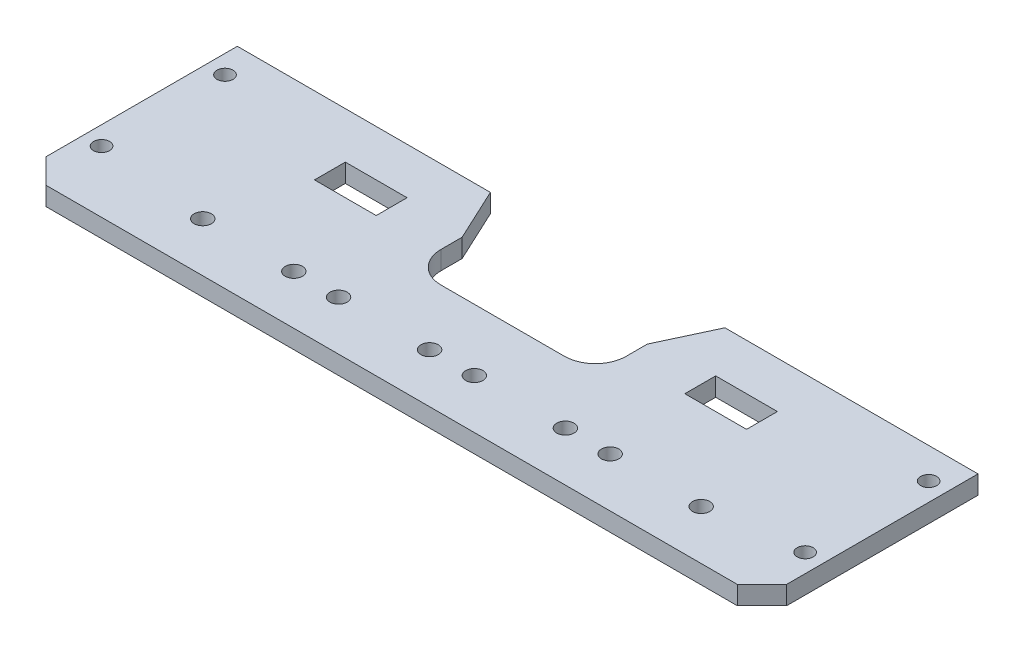
ISO-10303-21;
HEADER;
FILE_DESCRIPTION(('STEP AP214'),'2;1');
FILE_NAME('part.step','',(''),(''),'','','');
FILE_SCHEMA(('AUTOMOTIVE_DESIGN { 1 0 10303 214 1 1 1 1 }'));
ENDSEC;
DATA;
#1=APPLICATION_CONTEXT('core data for automotive mechanical design processes');
#2=APPLICATION_PROTOCOL_DEFINITION('international standard','automotive_design',2000,#1);
#3=PRODUCT_CONTEXT('',#1,'mechanical');
#4=PRODUCT('Part','Part','',(#3));
#5=PRODUCT_RELATED_PRODUCT_CATEGORY('part','',(#4));
#6=PRODUCT_DEFINITION_FORMATION('','',#4);
#7=PRODUCT_DEFINITION_CONTEXT('part definition',#1,'design');
#8=PRODUCT_DEFINITION('design','',#6,#7);
#9=PRODUCT_DEFINITION_SHAPE('','',#8);
#10=(LENGTH_UNIT() NAMED_UNIT(*) SI_UNIT(.MILLI.,.METRE.));
#11=(NAMED_UNIT(*) PLANE_ANGLE_UNIT() SI_UNIT($,.RADIAN.));
#12=(NAMED_UNIT(*) SI_UNIT($,.STERADIAN.) SOLID_ANGLE_UNIT());
#13=UNCERTAINTY_MEASURE_WITH_UNIT(LENGTH_MEASURE(1.E-05),#10,'distance_accuracy_value','');
#14=(GEOMETRIC_REPRESENTATION_CONTEXT(3) GLOBAL_UNCERTAINTY_ASSIGNED_CONTEXT((#13)) GLOBAL_UNIT_ASSIGNED_CONTEXT((#10,
#11,#12)) REPRESENTATION_CONTEXT('',''));
#15=CARTESIAN_POINT('',(0.,0.,0.));
#16=DIRECTION('',(0.,0.,1.));
#17=DIRECTION('',(1.,0.,0.));
#18=AXIS2_PLACEMENT_3D('',#15,#16,#17);
#19=CARTESIAN_POINT('',(-60.,3.,-17.5));
#20=DIRECTION('',(0.,0.,1.));
#21=DIRECTION('',(1.,0.,0.));
#22=AXIS2_PLACEMENT_3D('',#19,#20,#21);
#23=PLANE('',#22);
#24=DIRECTION('',(-1.,0.,0.));
#25=VECTOR('',#24,1.);
#26=CARTESIAN_POINT('',(-60.,3.,-17.5));
#27=LINE('',#26,#25);
#28=CARTESIAN_POINT('',(-19.,3.,-17.5));
#29=VERTEX_POINT('',#28);
#30=CARTESIAN_POINT('',(-60.,3.,-17.5));
#31=VERTEX_POINT('',#30);
#32=EDGE_CURVE('E352',#29,#31,#27,.T.);
#33=ORIENTED_EDGE('',*,*,#32,.F.);
#34=DIRECTION('',(0.,-1.,0.));
#35=VECTOR('',#34,1.);
#36=CARTESIAN_POINT('',(-19.,3.,-17.5));
#37=LINE('',#36,#35);
#38=CARTESIAN_POINT('',(-19.,0.,-17.5));
#39=VERTEX_POINT('',#38);
#40=EDGE_CURVE('E380',#29,#39,#37,.T.);
#41=ORIENTED_EDGE('',*,*,#40,.T.);
#42=DIRECTION('',(-1.,0.,0.));
#43=VECTOR('',#42,1.);
#44=CARTESIAN_POINT('',(-60.,0.,-17.5));
#45=LINE('',#44,#43);
#46=CARTESIAN_POINT('',(-60.,0.,-17.5));
#47=VERTEX_POINT('',#46);
#48=EDGE_CURVE('E363',#39,#47,#45,.T.);
#49=ORIENTED_EDGE('',*,*,#48,.T.);
#50=DIRECTION('',(0.,-1.,0.));
#51=VECTOR('',#50,1.);
#52=CARTESIAN_POINT('',(-60.,3.,-17.5));
#53=LINE('',#52,#51);
#54=EDGE_CURVE('E361',#31,#47,#53,.T.);
#55=ORIENTED_EDGE('',*,*,#54,.F.);
#56=EDGE_LOOP('',(#33,#41,#49,#55));
#57=FACE_BOUND('',#56,.T.);
#58=ADVANCED_FACE('F35',(#57),#23,.F.);
#59=CARTESIAN_POINT('',(60.,3.,-17.5));
#60=DIRECTION('',(-1.,0.,0.));
#61=DIRECTION('',(0.,0.,1.));
#62=AXIS2_PLACEMENT_3D('',#59,#60,#61);
#63=PLANE('',#62);
#64=DIRECTION('',(0.,0.,-1.));
#65=VECTOR('',#64,1.);
#66=CARTESIAN_POINT('',(60.,3.,-17.5));
#67=LINE('',#66,#65);
#68=CARTESIAN_POINT('',(60.,3.,13.5));
#69=VERTEX_POINT('',#68);
#70=CARTESIAN_POINT('',(60.,3.,-17.5));
#71=VERTEX_POINT('',#70);
#72=EDGE_CURVE('E350',#69,#71,#67,.T.);
#73=ORIENTED_EDGE('',*,*,#72,.F.);
#74=DIRECTION('',(0.,-1.,0.));
#75=VECTOR('',#74,1.);
#76=CARTESIAN_POINT('',(60.,3.,13.5));
#77=LINE('',#76,#75);
#78=CARTESIAN_POINT('',(60.,0.,13.5));
#79=VERTEX_POINT('',#78);
#80=EDGE_CURVE('E413',#69,#79,#77,.T.);
#81=ORIENTED_EDGE('',*,*,#80,.T.);
#82=DIRECTION('',(0.,0.,-1.));
#83=VECTOR('',#82,1.);
#84=CARTESIAN_POINT('',(60.,0.,-17.5));
#85=LINE('',#84,#83);
#86=CARTESIAN_POINT('',(60.,0.,-17.5));
#87=VERTEX_POINT('',#86);
#88=EDGE_CURVE('E343',#79,#87,#85,.T.);
#89=ORIENTED_EDGE('',*,*,#88,.T.);
#90=DIRECTION('',(0.,-1.,0.));
#91=VECTOR('',#90,1.);
#92=CARTESIAN_POINT('',(60.,3.,-17.5));
#93=LINE('',#92,#91);
#94=EDGE_CURVE('E372',#71,#87,#93,.T.);
#95=ORIENTED_EDGE('',*,*,#94,.F.);
#96=EDGE_LOOP('',(#73,#81,#89,#95));
#97=FACE_BOUND('',#96,.T.);
#98=ADVANCED_FACE('F434',(#97),#63,.F.);
#99=CARTESIAN_POINT('',(19.,0.,-17.5));
#100=VERTEX_POINT('',#99);
#101=EDGE_CURVE('E364',#87,#100,#45,.T.);
#102=ORIENTED_EDGE('',*,*,#101,.T.);
#103=DIRECTION('',(0.,1.,0.));
#104=VECTOR('',#103,1.);
#105=CARTESIAN_POINT('',(19.,3.,-17.5));
#106=LINE('',#105,#104);
#107=CARTESIAN_POINT('',(19.,3.,-17.5));
#108=VERTEX_POINT('',#107);
#109=EDGE_CURVE('E384',#100,#108,#106,.T.);
#110=ORIENTED_EDGE('',*,*,#109,.T.);
#111=EDGE_CURVE('E354',#71,#108,#27,.T.);
#112=ORIENTED_EDGE('',*,*,#111,.F.);
#113=ORIENTED_EDGE('',*,*,#94,.T.);
#114=EDGE_LOOP('',(#102,#110,#112,#113));
#115=FACE_BOUND('',#114,.T.);
#116=ADVANCED_FACE('F483',(#115),#23,.F.);
#117=CARTESIAN_POINT('',(-60.,3.,-17.5));
#118=DIRECTION('',(1.,0.,0.));
#119=DIRECTION('',(0.,0.,-1.));
#120=AXIS2_PLACEMENT_3D('',#117,#118,#119);
#121=PLANE('',#120);
#122=DIRECTION('',(0.,0.,1.));
#123=VECTOR('',#122,1.);
#124=CARTESIAN_POINT('',(-60.,0.,-17.5));
#125=LINE('',#124,#123);
#126=CARTESIAN_POINT('',(-60.,0.,13.5));
#127=VERTEX_POINT('',#126);
#128=EDGE_CURVE('E367',#47,#127,#125,.T.);
#129=ORIENTED_EDGE('',*,*,#128,.T.);
#130=DIRECTION('',(0.,1.,0.));
#131=VECTOR('',#130,1.);
#132=CARTESIAN_POINT('',(-60.,3.,13.5));
#133=LINE('',#132,#131);
#134=CARTESIAN_POINT('',(-60.,3.,13.5));
#135=VERTEX_POINT('',#134);
#136=EDGE_CURVE('E11',#127,#135,#133,.T.);
#137=ORIENTED_EDGE('',*,*,#136,.T.);
#138=DIRECTION('',(0.,0.,1.));
#139=VECTOR('',#138,1.);
#140=CARTESIAN_POINT('',(-60.,3.,-17.5));
#141=LINE('',#140,#139);
#142=EDGE_CURVE('E357',#31,#135,#141,.T.);
#143=ORIENTED_EDGE('',*,*,#142,.F.);
#144=ORIENTED_EDGE('',*,*,#54,.T.);
#145=EDGE_LOOP('',(#129,#137,#143,#144));
#146=FACE_BOUND('',#145,.T.);
#147=ADVANCED_FACE('F446',(#146),#121,.F.);
#148=CARTESIAN_POINT('',(-60.,3.,17.5));
#149=DIRECTION('',(0.,0.,-1.));
#150=DIRECTION('',(-1.,0.,0.));
#151=AXIS2_PLACEMENT_3D('',#148,#149,#150);
#152=PLANE('',#151);
#153=DIRECTION('',(1.,0.,0.));
#154=VECTOR('',#153,1.);
#155=CARTESIAN_POINT('',(-60.,0.,17.5));
#156=LINE('',#155,#154);
#157=CARTESIAN_POINT('',(-56.,0.,17.5));
#158=VERTEX_POINT('',#157);
#159=CARTESIAN_POINT('',(56.,0.,17.5));
#160=VERTEX_POINT('',#159);
#161=EDGE_CURVE('E353',#158,#160,#156,.T.);
#162=ORIENTED_EDGE('',*,*,#161,.T.);
#163=DIRECTION('',(0.,1.,0.));
#164=VECTOR('',#163,1.);
#165=CARTESIAN_POINT('',(56.,3.,17.5));
#166=LINE('',#165,#164);
#167=CARTESIAN_POINT('',(56.,3.,17.5));
#168=VERTEX_POINT('',#167);
#169=EDGE_CURVE('E56',#160,#168,#166,.T.);
#170=ORIENTED_EDGE('',*,*,#169,.T.);
#171=DIRECTION('',(1.,0.,0.));
#172=VECTOR('',#171,1.);
#173=CARTESIAN_POINT('',(-60.,3.,17.5));
#174=LINE('',#173,#172);
#175=CARTESIAN_POINT('',(-56.,3.,17.5));
#176=VERTEX_POINT('',#175);
#177=EDGE_CURVE('E359',#176,#168,#174,.T.);
#178=ORIENTED_EDGE('',*,*,#177,.F.);
#179=DIRECTION('',(0.,-1.,0.));
#180=VECTOR('',#179,1.);
#181=CARTESIAN_POINT('',(-56.,3.,17.5));
#182=LINE('',#181,#180);
#183=EDGE_CURVE('E420',#176,#158,#182,.T.);
#184=ORIENTED_EDGE('',*,*,#183,.T.);
#185=EDGE_LOOP('',(#162,#170,#178,#184));
#186=FACE_BOUND('',#185,.T.);
#187=ADVANCED_FACE('F440',(#186),#152,.F.);
#188=CARTESIAN_POINT('',(0.,3.,0.));
#189=DIRECTION('',(0.,1.,0.));
#190=DIRECTION('',(0.,0.,1.));
#191=AXIS2_PLACEMENT_3D('',#188,#189,#190);
#192=PLANE('',#191);
#193=DIRECTION('',(-1.,0.,0.));
#194=VECTOR('',#193,1.);
#195=CARTESIAN_POINT('',(35.,3.,-10.));
#196=LINE('',#195,#194);
#197=CARTESIAN_POINT('',(35.,3.,-10.));
#198=VERTEX_POINT('',#197);
#199=CARTESIAN_POINT('',(25.,3.,-10.));
#200=VERTEX_POINT('',#199);
#201=EDGE_CURVE('E193',#198,#200,#196,.T.);
#202=ORIENTED_EDGE('',*,*,#201,.F.);
#203=DIRECTION('',(0.,0.,-1.));
#204=VECTOR('',#203,1.);
#205=CARTESIAN_POINT('',(35.,3.,-10.));
#206=LINE('',#205,#204);
#207=CARTESIAN_POINT('',(35.,3.,-5.00000000000001));
#208=VERTEX_POINT('',#207);
#209=EDGE_CURVE('E211',#208,#198,#206,.T.);
#210=ORIENTED_EDGE('',*,*,#209,.F.);
#211=DIRECTION('',(1.,0.,0.));
#212=VECTOR('',#211,1.);
#213=CARTESIAN_POINT('',(35.,3.,-5.00000000000001));
#214=LINE('',#213,#212);
#215=CARTESIAN_POINT('',(25.,3.,-5.00000000000001));
#216=VERTEX_POINT('',#215);
#217=EDGE_CURVE('E214',#216,#208,#214,.T.);
#218=ORIENTED_EDGE('',*,*,#217,.F.);
#219=DIRECTION('',(0.,0.,1.));
#220=VECTOR('',#219,1.);
#221=CARTESIAN_POINT('',(25.,3.,-10.));
#222=LINE('',#221,#220);
#223=EDGE_CURVE('E220',#200,#216,#222,.T.);
#224=ORIENTED_EDGE('',*,*,#223,.F.);
#225=EDGE_LOOP('',(#202,#210,#218,#224));
#226=FACE_BOUND('',#225,.T.);
#227=DIRECTION('',(0.,0.,-1.));
#228=VECTOR('',#227,1.);
#229=CARTESIAN_POINT('',(-25.,3.,-10.));
#230=LINE('',#229,#228);
#231=CARTESIAN_POINT('',(-25.,3.,-5.));
#232=VERTEX_POINT('',#231);
#233=CARTESIAN_POINT('',(-25.,3.,-10.));
#234=VERTEX_POINT('',#233);
#235=EDGE_CURVE('E226',#232,#234,#230,.T.);
#236=ORIENTED_EDGE('',*,*,#235,.F.);
#237=DIRECTION('',(1.,0.,0.));
#238=VECTOR('',#237,1.);
#239=CARTESIAN_POINT('',(-35.,3.,-5.));
#240=LINE('',#239,#238);
#241=CARTESIAN_POINT('',(-35.,3.,-5.));
#242=VERTEX_POINT('',#241);
#243=EDGE_CURVE('E234',#242,#232,#240,.T.);
#244=ORIENTED_EDGE('',*,*,#243,.F.);
#245=DIRECTION('',(0.,0.,1.));
#246=VECTOR('',#245,1.);
#247=CARTESIAN_POINT('',(-35.,3.,-10.));
#248=LINE('',#247,#246);
#249=CARTESIAN_POINT('',(-35.,3.,-10.));
#250=VERTEX_POINT('',#249);
#251=EDGE_CURVE('E248',#250,#242,#248,.T.);
#252=ORIENTED_EDGE('',*,*,#251,.F.);
#253=DIRECTION('',(-1.,0.,0.));
#254=VECTOR('',#253,1.);
#255=CARTESIAN_POINT('',(-35.,3.,-10.));
#256=LINE('',#255,#254);
#257=EDGE_CURVE('E245',#234,#250,#256,.T.);
#258=ORIENTED_EDGE('',*,*,#257,.F.);
#259=EDGE_LOOP('',(#236,#244,#252,#258));
#260=FACE_BOUND('',#259,.T.);
#261=CARTESIAN_POINT('',(20.15,3.,9.5));
#262=DIRECTION('',(0.,1.,0.));
#263=DIRECTION('',(0.,0.,1.));
#264=AXIS2_PLACEMENT_3D('',#261,#262,#263);
#265=CIRCLE('',#264,1.4);
#266=CARTESIAN_POINT('',(20.15,3.,10.9));
#267=VERTEX_POINT('',#266);
#268=EDGE_CURVE('E266',#267,#267,#265,.T.);
#269=ORIENTED_EDGE('',*,*,#268,.F.);
#270=EDGE_LOOP('',(#269));
#271=FACE_BOUND('',#270,.T.);
#272=CARTESIAN_POINT('',(27.4,3.,9.50000000000001));
#273=DIRECTION('',(0.,1.,0.));
#274=DIRECTION('',(0.,0.,1.));
#275=AXIS2_PLACEMENT_3D('',#272,#273,#274);
#276=CIRCLE('',#275,1.4);
#277=CARTESIAN_POINT('',(27.4,3.,10.9));
#278=VERTEX_POINT('',#277);
#279=EDGE_CURVE('E272',#278,#278,#276,.T.);
#280=ORIENTED_EDGE('',*,*,#279,.F.);
#281=EDGE_LOOP('',(#280));
#282=FACE_BOUND('',#281,.T.);
#283=CARTESIAN_POINT('',(42.15,3.,9.50000000000001));
#284=DIRECTION('',(0.,1.,0.));
#285=DIRECTION('',(0.,0.,1.));
#286=AXIS2_PLACEMENT_3D('',#283,#284,#285);
#287=CIRCLE('',#286,1.4);
#288=CARTESIAN_POINT('',(42.15,3.,10.9));
#289=VERTEX_POINT('',#288);
#290=EDGE_CURVE('E278',#289,#289,#287,.T.);
#291=ORIENTED_EDGE('',*,*,#290,.F.);
#292=EDGE_LOOP('',(#291));
#293=FACE_BOUND('',#292,.T.);
#294=CARTESIAN_POINT('',(-1.85,3.,9.5));
#295=DIRECTION('',(0.,1.,0.));
#296=DIRECTION('',(0.,0.,1.));
#297=AXIS2_PLACEMENT_3D('',#294,#295,#296);
#298=CIRCLE('',#297,1.4);
#299=CARTESIAN_POINT('',(-1.85,3.,10.9));
#300=VERTEX_POINT('',#299);
#301=EDGE_CURVE('E284',#300,#300,#298,.T.);
#302=ORIENTED_EDGE('',*,*,#301,.F.);
#303=EDGE_LOOP('',(#302));
#304=FACE_BOUND('',#303,.T.);
#305=CARTESIAN_POINT('',(-16.6,3.,9.50000000000001));
#306=DIRECTION('',(0.,1.,0.));
#307=DIRECTION('',(0.,0.,1.));
#308=AXIS2_PLACEMENT_3D('',#305,#306,#307);
#309=CIRCLE('',#308,1.4);
#310=CARTESIAN_POINT('',(-16.6,3.,10.9));
#311=VERTEX_POINT('',#310);
#312=EDGE_CURVE('E290',#311,#311,#309,.T.);
#313=ORIENTED_EDGE('',*,*,#312,.F.);
#314=EDGE_LOOP('',(#313));
#315=FACE_BOUND('',#314,.T.);
#316=CARTESIAN_POINT('',(-23.85,3.,9.50000000000001));
#317=DIRECTION('',(0.,1.,0.));
#318=DIRECTION('',(0.,0.,1.));
#319=AXIS2_PLACEMENT_3D('',#316,#317,#318);
#320=CIRCLE('',#319,1.4);
#321=CARTESIAN_POINT('',(-23.85,3.,10.9));
#322=VERTEX_POINT('',#321);
#323=EDGE_CURVE('E296',#322,#322,#320,.T.);
#324=ORIENTED_EDGE('',*,*,#323,.F.);
#325=EDGE_LOOP('',(#324));
#326=FACE_BOUND('',#325,.T.);
#327=CARTESIAN_POINT('',(-38.6,3.,9.5));
#328=DIRECTION('',(0.,1.,0.));
#329=DIRECTION('',(0.,0.,1.));
#330=AXIS2_PLACEMENT_3D('',#327,#328,#329);
#331=CIRCLE('',#330,1.4);
#332=CARTESIAN_POINT('',(-38.6,3.,10.9));
#333=VERTEX_POINT('',#332);
#334=EDGE_CURVE('E255',#333,#333,#331,.T.);
#335=ORIENTED_EDGE('',*,*,#334,.F.);
#336=EDGE_LOOP('',(#335));
#337=FACE_BOUND('',#336,.T.);
#338=CARTESIAN_POINT('',(5.4,3.,9.50000000000001));
#339=DIRECTION('',(0.,1.,0.));
#340=DIRECTION('',(0.,0.,1.));
#341=AXIS2_PLACEMENT_3D('',#338,#339,#340);
#342=CIRCLE('',#341,1.4);
#343=CARTESIAN_POINT('',(5.4,3.,10.9));
#344=VERTEX_POINT('',#343);
#345=EDGE_CURVE('E265',#344,#344,#342,.T.);
#346=ORIENTED_EDGE('',*,*,#345,.F.);
#347=EDGE_LOOP('',(#346));
#348=FACE_BOUND('',#347,.T.);
#349=CARTESIAN_POINT('',(-57.,3.,7.50000000000001));
#350=DIRECTION('',(0.,1.,0.));
#351=DIRECTION('',(0.,0.,1.));
#352=AXIS2_PLACEMENT_3D('',#349,#350,#351);
#353=CIRCLE('',#352,1.3);
#354=CARTESIAN_POINT('',(-57.,3.,8.80000000000001));
#355=VERTEX_POINT('',#354);
#356=EDGE_CURVE('E314',#355,#355,#353,.T.);
#357=ORIENTED_EDGE('',*,*,#356,.F.);
#358=EDGE_LOOP('',(#357));
#359=FACE_BOUND('',#358,.T.);
#360=CARTESIAN_POINT('',(57.,3.,7.50000000000001));
#361=DIRECTION('',(0.,1.,0.));
#362=DIRECTION('',(0.,0.,-1.));
#363=AXIS2_PLACEMENT_3D('',#360,#361,#362);
#364=CIRCLE('',#363,1.3);
#365=CARTESIAN_POINT('',(57.,3.,6.2));
#366=VERTEX_POINT('',#365);
#367=EDGE_CURVE('E320',#366,#366,#364,.T.);
#368=ORIENTED_EDGE('',*,*,#367,.F.);
#369=EDGE_LOOP('',(#368));
#370=FACE_BOUND('',#369,.T.);
#371=CARTESIAN_POINT('',(57.,3.,-12.5));
#372=DIRECTION('',(0.,1.,0.));
#373=DIRECTION('',(0.,0.,-1.));
#374=AXIS2_PLACEMENT_3D('',#371,#372,#373);
#375=CIRCLE('',#374,1.3);
#376=CARTESIAN_POINT('',(57.,3.,-13.8));
#377=VERTEX_POINT('',#376);
#378=EDGE_CURVE('E307',#377,#377,#375,.T.);
#379=ORIENTED_EDGE('',*,*,#378,.F.);
#380=EDGE_LOOP('',(#379));
#381=FACE_BOUND('',#380,.T.);
#382=CARTESIAN_POINT('',(-57.,3.,-12.5));
#383=DIRECTION('',(0.,1.,0.));
#384=DIRECTION('',(0.,0.,1.));
#385=AXIS2_PLACEMENT_3D('',#382,#383,#384);
#386=CIRCLE('',#385,1.3);
#387=CARTESIAN_POINT('',(-57.,3.,-11.2));
#388=VERTEX_POINT('',#387);
#389=EDGE_CURVE('E313',#388,#388,#386,.T.);
#390=ORIENTED_EDGE('',*,*,#389,.F.);
#391=EDGE_LOOP('',(#390));
#392=FACE_BOUND('',#391,.T.);
#393=ORIENTED_EDGE('',*,*,#177,.T.);
#394=DIRECTION('',(-0.707106781186549,0.,0.707106781186546));
#395=VECTOR('',#394,1.);
#396=CARTESIAN_POINT('',(36.7499999999999,3.,36.75));
#397=LINE('',#396,#395);
#398=EDGE_CURVE('E43',#168,#69,#397,.F.);
#399=ORIENTED_EDGE('',*,*,#398,.T.);
#400=ORIENTED_EDGE('',*,*,#72,.T.);
#401=ORIENTED_EDGE('',*,*,#111,.T.);
#402=DIRECTION('',(0.4226182617407,0.,-0.90630778703665));
#403=VECTOR('',#402,1.);
#404=CARTESIAN_POINT('',(8.90359341473108,3.,4.15181379438752));
#405=LINE('',#404,#403);
#406=CARTESIAN_POINT('',(15.,3.,-8.92197231796174));
#407=VERTEX_POINT('',#406);
#408=EDGE_CURVE('E387',#108,#407,#405,.F.);
#409=ORIENTED_EDGE('',*,*,#408,.T.);
#410=DIRECTION('',(0.,0.,-1.));
#411=VECTOR('',#410,1.);
#412=CARTESIAN_POINT('',(15.,3.,-17.5));
#413=LINE('',#412,#411);
#414=CARTESIAN_POINT('',(15.,3.,-5.5));
#415=VERTEX_POINT('',#414);
#416=EDGE_CURVE('E338',#415,#407,#413,.T.);
#417=ORIENTED_EDGE('',*,*,#416,.F.);
#418=CARTESIAN_POINT('',(10.,3.,-5.5));
#419=DIRECTION('',(0.,1.,0.));
#420=DIRECTION('',(0.,0.,1.));
#421=AXIS2_PLACEMENT_3D('',#418,#419,#420);
#422=CIRCLE('',#421,5.);
#423=CARTESIAN_POINT('',(10.,3.,-0.499999999999996));
#424=VERTEX_POINT('',#423);
#425=EDGE_CURVE('E405',#415,#424,#422,.F.);
#426=ORIENTED_EDGE('',*,*,#425,.T.);
#427=DIRECTION('',(1.,0.,0.));
#428=VECTOR('',#427,1.);
#429=CARTESIAN_POINT('',(-15.,3.,-0.499999999999993));
#430=LINE('',#429,#428);
#431=CARTESIAN_POINT('',(-10.,3.,-0.499999999999994));
#432=VERTEX_POINT('',#431);
#433=EDGE_CURVE('E346',#432,#424,#430,.T.);
#434=ORIENTED_EDGE('',*,*,#433,.F.);
#435=CARTESIAN_POINT('',(-10.,3.,-5.49999999999999));
#436=DIRECTION('',(0.,1.,0.));
#437=DIRECTION('',(0.,0.,1.));
#438=AXIS2_PLACEMENT_3D('',#435,#436,#437);
#439=CIRCLE('',#438,5.);
#440=CARTESIAN_POINT('',(-15.,3.,-5.49999999999999));
#441=VERTEX_POINT('',#440);
#442=EDGE_CURVE('E409',#432,#441,#439,.F.);
#443=ORIENTED_EDGE('',*,*,#442,.T.);
#444=DIRECTION('',(0.,0.,1.));
#445=VECTOR('',#444,1.);
#446=CARTESIAN_POINT('',(-15.,3.,-17.5));
#447=LINE('',#446,#445);
#448=CARTESIAN_POINT('',(-15.,3.,-8.92197231796174));
#449=VERTEX_POINT('',#448);
#450=EDGE_CURVE('E331',#449,#441,#447,.T.);
#451=ORIENTED_EDGE('',*,*,#450,.F.);
#452=DIRECTION('',(0.4226182617407,0.,0.90630778703665));
#453=VECTOR('',#452,1.);
#454=CARTESIAN_POINT('',(-8.90359341473106,3.,4.15181379438752));
#455=LINE('',#454,#453);
#456=EDGE_CURVE('E378',#449,#29,#455,.F.);
#457=ORIENTED_EDGE('',*,*,#456,.T.);
#458=ORIENTED_EDGE('',*,*,#32,.T.);
#459=ORIENTED_EDGE('',*,*,#142,.T.);
#460=DIRECTION('',(-0.707106781186546,0.,-0.707106781186549));
#461=VECTOR('',#460,1.);
#462=CARTESIAN_POINT('',(-36.7500000000001,3.,36.75));
#463=LINE('',#462,#461);
#464=EDGE_CURVE('E424',#135,#176,#463,.F.);
#465=ORIENTED_EDGE('',*,*,#464,.T.);
#466=EDGE_LOOP('',(#393,#399,#400,#401,#409,#417,#426,#434,#443,#451,#457,#458,#459,#465));
#467=FACE_BOUND('',#466,.T.);
#468=ADVANCED_FACE('F428',(#226,#260,#271,#282,#293,#304,#315,#326,#337,#348,#359,#370,#381,
#392,#467),#192,.T.);
#469=CARTESIAN_POINT('',(0.,0.,0.));
#470=DIRECTION('',(0.,1.,0.));
#471=DIRECTION('',(0.,0.,1.));
#472=AXIS2_PLACEMENT_3D('',#469,#470,#471);
#473=PLANE('',#472);
#474=DIRECTION('',(0.,0.,-1.));
#475=VECTOR('',#474,1.);
#476=CARTESIAN_POINT('',(35.,0.,-10.));
#477=LINE('',#476,#475);
#478=CARTESIAN_POINT('',(35.,0.,-5.00000000000001));
#479=VERTEX_POINT('',#478);
#480=CARTESIAN_POINT('',(35.,0.,-10.));
#481=VERTEX_POINT('',#480);
#482=EDGE_CURVE('E198',#479,#481,#477,.T.);
#483=ORIENTED_EDGE('',*,*,#482,.T.);
#484=DIRECTION('',(-1.,0.,0.));
#485=VECTOR('',#484,1.);
#486=CARTESIAN_POINT('',(35.,0.,-10.));
#487=LINE('',#486,#485);
#488=CARTESIAN_POINT('',(25.,0.,-10.));
#489=VERTEX_POINT('',#488);
#490=EDGE_CURVE('E190',#481,#489,#487,.T.);
#491=ORIENTED_EDGE('',*,*,#490,.T.);
#492=DIRECTION('',(0.,0.,1.));
#493=VECTOR('',#492,1.);
#494=CARTESIAN_POINT('',(25.,0.,-10.));
#495=LINE('',#494,#493);
#496=CARTESIAN_POINT('',(25.,0.,-5.00000000000001));
#497=VERTEX_POINT('',#496);
#498=EDGE_CURVE('E202',#489,#497,#495,.T.);
#499=ORIENTED_EDGE('',*,*,#498,.T.);
#500=DIRECTION('',(1.,0.,0.));
#501=VECTOR('',#500,1.);
#502=CARTESIAN_POINT('',(35.,0.,-5.00000000000001));
#503=LINE('',#502,#501);
#504=EDGE_CURVE('E206',#497,#479,#503,.T.);
#505=ORIENTED_EDGE('',*,*,#504,.T.);
#506=EDGE_LOOP('',(#483,#491,#499,#505));
#507=FACE_BOUND('',#506,.T.);
#508=DIRECTION('',(1.,0.,0.));
#509=VECTOR('',#508,1.);
#510=CARTESIAN_POINT('',(-35.,0.,-5.));
#511=LINE('',#510,#509);
#512=CARTESIAN_POINT('',(-35.,0.,-5.));
#513=VERTEX_POINT('',#512);
#514=CARTESIAN_POINT('',(-25.,0.,-5.));
#515=VERTEX_POINT('',#514);
#516=EDGE_CURVE('E240',#513,#515,#511,.T.);
#517=ORIENTED_EDGE('',*,*,#516,.T.);
#518=DIRECTION('',(0.,0.,-1.));
#519=VECTOR('',#518,1.);
#520=CARTESIAN_POINT('',(-25.,0.,-10.));
#521=LINE('',#520,#519);
#522=CARTESIAN_POINT('',(-25.,0.,-10.));
#523=VERTEX_POINT('',#522);
#524=EDGE_CURVE('E230',#515,#523,#521,.T.);
#525=ORIENTED_EDGE('',*,*,#524,.T.);
#526=DIRECTION('',(-1.,0.,0.));
#527=VECTOR('',#526,1.);
#528=CARTESIAN_POINT('',(-35.,0.,-10.));
#529=LINE('',#528,#527);
#530=CARTESIAN_POINT('',(-35.,0.,-10.));
#531=VERTEX_POINT('',#530);
#532=EDGE_CURVE('E233',#523,#531,#529,.T.);
#533=ORIENTED_EDGE('',*,*,#532,.T.);
#534=DIRECTION('',(0.,0.,1.));
#535=VECTOR('',#534,1.);
#536=CARTESIAN_POINT('',(-35.,0.,-10.));
#537=LINE('',#536,#535);
#538=EDGE_CURVE('E237',#531,#513,#537,.T.);
#539=ORIENTED_EDGE('',*,*,#538,.T.);
#540=EDGE_LOOP('',(#517,#525,#533,#539));
#541=FACE_BOUND('',#540,.T.);
#542=CARTESIAN_POINT('',(20.15,0.,9.5));
#543=DIRECTION('',(0.,1.,0.));
#544=DIRECTION('',(0.,0.,1.));
#545=AXIS2_PLACEMENT_3D('',#542,#543,#544);
#546=CIRCLE('',#545,1.4);
#547=CARTESIAN_POINT('',(20.15,0.,10.9));
#548=VERTEX_POINT('',#547);
#549=EDGE_CURVE('E262',#548,#548,#546,.T.);
#550=ORIENTED_EDGE('',*,*,#549,.T.);
#551=EDGE_LOOP('',(#550));
#552=FACE_BOUND('',#551,.T.);
#553=CARTESIAN_POINT('',(27.4,0.,9.50000000000001));
#554=DIRECTION('',(0.,1.,0.));
#555=DIRECTION('',(0.,0.,1.));
#556=AXIS2_PLACEMENT_3D('',#553,#554,#555);
#557=CIRCLE('',#556,1.4);
#558=CARTESIAN_POINT('',(27.4,0.,10.9));
#559=VERTEX_POINT('',#558);
#560=EDGE_CURVE('E269',#559,#559,#557,.T.);
#561=ORIENTED_EDGE('',*,*,#560,.T.);
#562=EDGE_LOOP('',(#561));
#563=FACE_BOUND('',#562,.T.);
#564=CARTESIAN_POINT('',(42.15,0.,9.50000000000001));
#565=DIRECTION('',(0.,1.,0.));
#566=DIRECTION('',(0.,0.,1.));
#567=AXIS2_PLACEMENT_3D('',#564,#565,#566);
#568=CIRCLE('',#567,1.4);
#569=CARTESIAN_POINT('',(42.15,0.,10.9));
#570=VERTEX_POINT('',#569);
#571=EDGE_CURVE('E275',#570,#570,#568,.T.);
#572=ORIENTED_EDGE('',*,*,#571,.T.);
#573=EDGE_LOOP('',(#572));
#574=FACE_BOUND('',#573,.T.);
#575=CARTESIAN_POINT('',(-1.85,0.,9.5));
#576=DIRECTION('',(0.,1.,0.));
#577=DIRECTION('',(0.,0.,1.));
#578=AXIS2_PLACEMENT_3D('',#575,#576,#577);
#579=CIRCLE('',#578,1.4);
#580=CARTESIAN_POINT('',(-1.85,0.,10.9));
#581=VERTEX_POINT('',#580);
#582=EDGE_CURVE('E281',#581,#581,#579,.T.);
#583=ORIENTED_EDGE('',*,*,#582,.T.);
#584=EDGE_LOOP('',(#583));
#585=FACE_BOUND('',#584,.T.);
#586=CARTESIAN_POINT('',(-16.6,0.,9.50000000000001));
#587=DIRECTION('',(0.,1.,0.));
#588=DIRECTION('',(0.,0.,1.));
#589=AXIS2_PLACEMENT_3D('',#586,#587,#588);
#590=CIRCLE('',#589,1.4);
#591=CARTESIAN_POINT('',(-16.6,0.,10.9));
#592=VERTEX_POINT('',#591);
#593=EDGE_CURVE('E287',#592,#592,#590,.T.);
#594=ORIENTED_EDGE('',*,*,#593,.T.);
#595=EDGE_LOOP('',(#594));
#596=FACE_BOUND('',#595,.T.);
#597=CARTESIAN_POINT('',(-23.85,0.,9.50000000000001));
#598=DIRECTION('',(0.,1.,0.));
#599=DIRECTION('',(0.,0.,1.));
#600=AXIS2_PLACEMENT_3D('',#597,#598,#599);
#601=CIRCLE('',#600,1.4);
#602=CARTESIAN_POINT('',(-23.85,0.,10.9));
#603=VERTEX_POINT('',#602);
#604=EDGE_CURVE('E293',#603,#603,#601,.T.);
#605=ORIENTED_EDGE('',*,*,#604,.T.);
#606=EDGE_LOOP('',(#605));
#607=FACE_BOUND('',#606,.T.);
#608=CARTESIAN_POINT('',(-38.6,0.,9.5));
#609=DIRECTION('',(0.,1.,0.));
#610=DIRECTION('',(0.,0.,1.));
#611=AXIS2_PLACEMENT_3D('',#608,#609,#610);
#612=CIRCLE('',#611,1.4);
#613=CARTESIAN_POINT('',(-38.6,0.,10.9));
#614=VERTEX_POINT('',#613);
#615=EDGE_CURVE('E299',#614,#614,#612,.T.);
#616=ORIENTED_EDGE('',*,*,#615,.T.);
#617=EDGE_LOOP('',(#616));
#618=FACE_BOUND('',#617,.T.);
#619=CARTESIAN_POINT('',(5.4,0.,9.50000000000001));
#620=DIRECTION('',(0.,1.,0.));
#621=DIRECTION('',(0.,0.,1.));
#622=AXIS2_PLACEMENT_3D('',#619,#620,#621);
#623=CIRCLE('',#622,1.4);
#624=CARTESIAN_POINT('',(5.4,0.,10.9));
#625=VERTEX_POINT('',#624);
#626=EDGE_CURVE('E304',#625,#625,#623,.T.);
#627=ORIENTED_EDGE('',*,*,#626,.T.);
#628=EDGE_LOOP('',(#627));
#629=FACE_BOUND('',#628,.T.);
#630=CARTESIAN_POINT('',(-57.,0.,7.50000000000001));
#631=DIRECTION('',(0.,1.,0.));
#632=DIRECTION('',(0.,0.,1.));
#633=AXIS2_PLACEMENT_3D('',#630,#631,#632);
#634=CIRCLE('',#633,1.3);
#635=CARTESIAN_POINT('',(-57.,0.,8.80000000000001));
#636=VERTEX_POINT('',#635);
#637=EDGE_CURVE('E310',#636,#636,#634,.T.);
#638=ORIENTED_EDGE('',*,*,#637,.T.);
#639=EDGE_LOOP('',(#638));
#640=FACE_BOUND('',#639,.T.);
#641=CARTESIAN_POINT('',(57.,0.,7.50000000000001));
#642=DIRECTION('',(0.,1.,0.));
#643=DIRECTION('',(0.,0.,-1.));
#644=AXIS2_PLACEMENT_3D('',#641,#642,#643);
#645=CIRCLE('',#644,1.3);
#646=CARTESIAN_POINT('',(57.,0.,6.2));
#647=VERTEX_POINT('',#646);
#648=EDGE_CURVE('E317',#647,#647,#645,.T.);
#649=ORIENTED_EDGE('',*,*,#648,.T.);
#650=EDGE_LOOP('',(#649));
#651=FACE_BOUND('',#650,.T.);
#652=CARTESIAN_POINT('',(57.,0.,-12.5));
#653=DIRECTION('',(0.,1.,0.));
#654=DIRECTION('',(0.,0.,-1.));
#655=AXIS2_PLACEMENT_3D('',#652,#653,#654);
#656=CIRCLE('',#655,1.3);
#657=CARTESIAN_POINT('',(57.,0.,-13.8));
#658=VERTEX_POINT('',#657);
#659=EDGE_CURVE('E323',#658,#658,#656,.T.);
#660=ORIENTED_EDGE('',*,*,#659,.T.);
#661=EDGE_LOOP('',(#660));
#662=FACE_BOUND('',#661,.T.);
#663=CARTESIAN_POINT('',(-57.,0.,-12.5));
#664=DIRECTION('',(0.,1.,0.));
#665=DIRECTION('',(0.,0.,1.));
#666=AXIS2_PLACEMENT_3D('',#663,#664,#665);
#667=CIRCLE('',#666,1.3);
#668=CARTESIAN_POINT('',(-57.,0.,-11.2));
#669=VERTEX_POINT('',#668);
#670=EDGE_CURVE('E328',#669,#669,#667,.T.);
#671=ORIENTED_EDGE('',*,*,#670,.T.);
#672=EDGE_LOOP('',(#671));
#673=FACE_BOUND('',#672,.T.);
#674=ORIENTED_EDGE('',*,*,#88,.F.);
#675=DIRECTION('',(0.707106781186549,0.,-0.707106781186546));
#676=VECTOR('',#675,1.);
#677=CARTESIAN_POINT('',(60.,0.,13.5));
#678=LINE('',#677,#676);
#679=EDGE_CURVE('E418',#79,#160,#678,.F.);
#680=ORIENTED_EDGE('',*,*,#679,.T.);
#681=ORIENTED_EDGE('',*,*,#161,.F.);
#682=DIRECTION('',(0.707106781186546,0.,0.707106781186549));
#683=VECTOR('',#682,1.);
#684=CARTESIAN_POINT('',(-56.,0.,17.5));
#685=LINE('',#684,#683);
#686=EDGE_CURVE('E416',#158,#127,#685,.F.);
#687=ORIENTED_EDGE('',*,*,#686,.T.);
#688=ORIENTED_EDGE('',*,*,#128,.F.);
#689=ORIENTED_EDGE('',*,*,#48,.F.);
#690=DIRECTION('',(-0.4226182617407,0.,-0.90630778703665));
#691=VECTOR('',#690,1.);
#692=CARTESIAN_POINT('',(-15.,0.,-8.92197231796174));
#693=LINE('',#692,#691);
#694=CARTESIAN_POINT('',(-15.,0.,-8.92197231796174));
#695=VERTEX_POINT('',#694);
#696=EDGE_CURVE('E382',#39,#695,#693,.F.);
#697=ORIENTED_EDGE('',*,*,#696,.T.);
#698=DIRECTION('',(0.,0.,1.));
#699=VECTOR('',#698,1.);
#700=CARTESIAN_POINT('',(-15.,0.,-17.5));
#701=LINE('',#700,#699);
#702=CARTESIAN_POINT('',(-15.,0.,-5.49999999999999));
#703=VERTEX_POINT('',#702);
#704=EDGE_CURVE('E334',#695,#703,#701,.T.);
#705=ORIENTED_EDGE('',*,*,#704,.T.);
#706=CARTESIAN_POINT('',(-10.,0.,-5.49999999999999));
#707=DIRECTION('',(0.,1.,0.));
#708=DIRECTION('',(0.,0.,1.));
#709=AXIS2_PLACEMENT_3D('',#706,#707,#708);
#710=CIRCLE('',#709,5.);
#711=CARTESIAN_POINT('',(-10.,0.,-0.499999999999994));
#712=VERTEX_POINT('',#711);
#713=EDGE_CURVE('E411',#703,#712,#710,.T.);
#714=ORIENTED_EDGE('',*,*,#713,.T.);
#715=DIRECTION('',(1.,0.,0.));
#716=VECTOR('',#715,1.);
#717=CARTESIAN_POINT('',(-15.,0.,-0.499999999999993));
#718=LINE('',#717,#716);
#719=CARTESIAN_POINT('',(10.,0.,-0.499999999999996));
#720=VERTEX_POINT('',#719);
#721=EDGE_CURVE('E337',#712,#720,#718,.T.);
#722=ORIENTED_EDGE('',*,*,#721,.T.);
#723=CARTESIAN_POINT('',(10.,0.,-5.5));
#724=DIRECTION('',(0.,1.,0.));
#725=DIRECTION('',(0.,0.,1.));
#726=AXIS2_PLACEMENT_3D('',#723,#724,#725);
#727=CIRCLE('',#726,5.);
#728=CARTESIAN_POINT('',(15.,0.,-5.5));
#729=VERTEX_POINT('',#728);
#730=EDGE_CURVE('E407',#720,#729,#727,.T.);
#731=ORIENTED_EDGE('',*,*,#730,.T.);
#732=DIRECTION('',(0.,0.,-1.));
#733=VECTOR('',#732,1.);
#734=CARTESIAN_POINT('',(15.,0.,-17.5));
#735=LINE('',#734,#733);
#736=CARTESIAN_POINT('',(15.,0.,-8.92197231796174));
#737=VERTEX_POINT('',#736);
#738=EDGE_CURVE('E341',#729,#737,#735,.T.);
#739=ORIENTED_EDGE('',*,*,#738,.T.);
#740=DIRECTION('',(-0.4226182617407,0.,0.90630778703665));
#741=VECTOR('',#740,1.);
#742=CARTESIAN_POINT('',(19.,0.,-17.5));
#743=LINE('',#742,#741);
#744=EDGE_CURVE('E393',#737,#100,#743,.F.);
#745=ORIENTED_EDGE('',*,*,#744,.T.);
#746=ORIENTED_EDGE('',*,*,#101,.F.);
#747=EDGE_LOOP('',(#674,#680,#681,#687,#688,#689,#697,#705,#714,#722,#731,#739,#745,#746));
#748=FACE_BOUND('',#747,.T.);
#749=ADVANCED_FACE('F208',(#507,#541,#552,#563,#574,#585,#596,#607,#618,#629,#640,#651,#662,
#673,#748),#473,.F.);
#750=CARTESIAN_POINT('',(-15.,0.,-17.5));
#751=DIRECTION('',(-1.,0.,0.));
#752=DIRECTION('',(0.,0.,1.));
#753=AXIS2_PLACEMENT_3D('',#750,#751,#752);
#754=PLANE('',#753);
#755=ORIENTED_EDGE('',*,*,#450,.T.);
#756=DIRECTION('',(0.,1.,0.));
#757=VECTOR('',#756,1.);
#758=CARTESIAN_POINT('',(-15.,0.,-5.49999999999999));
#759=LINE('',#758,#757);
#760=EDGE_CURVE('E403',#441,#703,#759,.F.);
#761=ORIENTED_EDGE('',*,*,#760,.T.);
#762=ORIENTED_EDGE('',*,*,#704,.F.);
#763=DIRECTION('',(0.,1.,0.));
#764=VECTOR('',#763,1.);
#765=CARTESIAN_POINT('',(-15.,0.,-8.92197231796174));
#766=LINE('',#765,#764);
#767=EDGE_CURVE('E375',#695,#449,#766,.T.);
#768=ORIENTED_EDGE('',*,*,#767,.T.);
#769=EDGE_LOOP('',(#755,#761,#762,#768));
#770=FACE_BOUND('',#769,.T.);
#771=ADVANCED_FACE('F458',(#770),#754,.F.);
#772=CARTESIAN_POINT('',(15.,0.,-17.5));
#773=DIRECTION('',(1.,0.,0.));
#774=DIRECTION('',(0.,0.,-1.));
#775=AXIS2_PLACEMENT_3D('',#772,#773,#774);
#776=PLANE('',#775);
#777=ORIENTED_EDGE('',*,*,#738,.F.);
#778=DIRECTION('',(0.,1.,0.));
#779=VECTOR('',#778,1.);
#780=CARTESIAN_POINT('',(15.,3.,-5.5));
#781=LINE('',#780,#779);
#782=EDGE_CURVE('E395',#729,#415,#781,.T.);
#783=ORIENTED_EDGE('',*,*,#782,.T.);
#784=ORIENTED_EDGE('',*,*,#416,.T.);
#785=DIRECTION('',(0.,-1.,0.));
#786=VECTOR('',#785,1.);
#787=CARTESIAN_POINT('',(15.,0.,-8.92197231796174));
#788=LINE('',#787,#786);
#789=EDGE_CURVE('E390',#407,#737,#788,.T.);
#790=ORIENTED_EDGE('',*,*,#789,.T.);
#791=EDGE_LOOP('',(#777,#783,#784,#790));
#792=FACE_BOUND('',#791,.T.);
#793=ADVANCED_FACE('F476',(#792),#776,.F.);
#794=CARTESIAN_POINT('',(-15.,0.,-0.499999999999993));
#795=DIRECTION('',(0.,0.,1.));
#796=DIRECTION('',(1.,0.,0.));
#797=AXIS2_PLACEMENT_3D('',#794,#795,#796);
#798=PLANE('',#797);
#799=ORIENTED_EDGE('',*,*,#433,.T.);
#800=DIRECTION('',(0.,1.,0.));
#801=VECTOR('',#800,1.);
#802=CARTESIAN_POINT('',(10.,0.,-0.499999999999996));
#803=LINE('',#802,#801);
#804=EDGE_CURVE('E401',#424,#720,#803,.F.);
#805=ORIENTED_EDGE('',*,*,#804,.T.);
#806=ORIENTED_EDGE('',*,*,#721,.F.);
#807=DIRECTION('',(0.,1.,0.));
#808=VECTOR('',#807,1.);
#809=CARTESIAN_POINT('',(-10.,3.,-0.499999999999994));
#810=LINE('',#809,#808);
#811=EDGE_CURVE('E398',#712,#432,#810,.T.);
#812=ORIENTED_EDGE('',*,*,#811,.T.);
#813=EDGE_LOOP('',(#799,#805,#806,#812));
#814=FACE_BOUND('',#813,.T.);
#815=ADVANCED_FACE('F467',(#814),#798,.F.);
#816=CARTESIAN_POINT('',(-57.,0.,-12.5));
#817=DIRECTION('',(0.,1.,0.));
#818=DIRECTION('',(0.,0.,1.));
#819=AXIS2_PLACEMENT_3D('',#816,#817,#818);
#820=CYLINDRICAL_SURFACE('',#819,1.3);
#821=ORIENTED_EDGE('',*,*,#670,.F.);
#822=EDGE_LOOP('',(#821));
#823=FACE_BOUND('',#822,.T.);
#824=ORIENTED_EDGE('',*,*,#389,.T.);
#825=EDGE_LOOP('',(#824));
#826=FACE_BOUND('',#825,.T.);
#827=ADVANCED_FACE('F721',(#823,#826),#820,.F.);
#828=CARTESIAN_POINT('',(57.,0.,-12.5));
#829=DIRECTION('',(0.,1.,0.));
#830=DIRECTION('',(0.,0.,1.));
#831=AXIS2_PLACEMENT_3D('',#828,#829,#830);
#832=CYLINDRICAL_SURFACE('',#831,1.3);
#833=ORIENTED_EDGE('',*,*,#659,.F.);
#834=EDGE_LOOP('',(#833));
#835=FACE_BOUND('',#834,.T.);
#836=ORIENTED_EDGE('',*,*,#378,.T.);
#837=EDGE_LOOP('',(#836));
#838=FACE_BOUND('',#837,.T.);
#839=ADVANCED_FACE('F713',(#835,#838),#832,.F.);
#840=CARTESIAN_POINT('',(57.,0.,7.50000000000001));
#841=DIRECTION('',(0.,1.,0.));
#842=DIRECTION('',(0.,0.,1.));
#843=AXIS2_PLACEMENT_3D('',#840,#841,#842);
#844=CYLINDRICAL_SURFACE('',#843,1.3);
#845=ORIENTED_EDGE('',*,*,#648,.F.);
#846=EDGE_LOOP('',(#845));
#847=FACE_BOUND('',#846,.T.);
#848=ORIENTED_EDGE('',*,*,#367,.T.);
#849=EDGE_LOOP('',(#848));
#850=FACE_BOUND('',#849,.T.);
#851=ADVANCED_FACE('F705',(#847,#850),#844,.F.);
#852=CARTESIAN_POINT('',(-57.,0.,7.50000000000001));
#853=DIRECTION('',(0.,1.,0.));
#854=DIRECTION('',(0.,0.,1.));
#855=AXIS2_PLACEMENT_3D('',#852,#853,#854);
#856=CYLINDRICAL_SURFACE('',#855,1.3);
#857=ORIENTED_EDGE('',*,*,#637,.F.);
#858=EDGE_LOOP('',(#857));
#859=FACE_BOUND('',#858,.T.);
#860=ORIENTED_EDGE('',*,*,#356,.T.);
#861=EDGE_LOOP('',(#860));
#862=FACE_BOUND('',#861,.T.);
#863=ADVANCED_FACE('F697',(#859,#862),#856,.F.);
#864=CARTESIAN_POINT('',(5.4,0.,9.50000000000001));
#865=DIRECTION('',(0.,1.,0.));
#866=DIRECTION('',(0.,0.,1.));
#867=AXIS2_PLACEMENT_3D('',#864,#865,#866);
#868=CYLINDRICAL_SURFACE('',#867,1.4);
#869=ORIENTED_EDGE('',*,*,#626,.F.);
#870=EDGE_LOOP('',(#869));
#871=FACE_BOUND('',#870,.T.);
#872=ORIENTED_EDGE('',*,*,#345,.T.);
#873=EDGE_LOOP('',(#872));
#874=FACE_BOUND('',#873,.T.);
#875=ADVANCED_FACE('F689',(#871,#874),#868,.F.);
#876=CARTESIAN_POINT('',(-38.6,0.,9.5));
#877=DIRECTION('',(0.,1.,0.));
#878=DIRECTION('',(0.,0.,1.));
#879=AXIS2_PLACEMENT_3D('',#876,#877,#878);
#880=CYLINDRICAL_SURFACE('',#879,1.4);
#881=ORIENTED_EDGE('',*,*,#615,.F.);
#882=EDGE_LOOP('',(#881));
#883=FACE_BOUND('',#882,.T.);
#884=ORIENTED_EDGE('',*,*,#334,.T.);
#885=EDGE_LOOP('',(#884));
#886=FACE_BOUND('',#885,.T.);
#887=ADVANCED_FACE('F681',(#883,#886),#880,.F.);
#888=CARTESIAN_POINT('',(-23.85,0.,9.50000000000001));
#889=DIRECTION('',(0.,1.,0.));
#890=DIRECTION('',(0.,0.,1.));
#891=AXIS2_PLACEMENT_3D('',#888,#889,#890);
#892=CYLINDRICAL_SURFACE('',#891,1.4);
#893=ORIENTED_EDGE('',*,*,#604,.F.);
#894=EDGE_LOOP('',(#893));
#895=FACE_BOUND('',#894,.T.);
#896=ORIENTED_EDGE('',*,*,#323,.T.);
#897=EDGE_LOOP('',(#896));
#898=FACE_BOUND('',#897,.T.);
#899=ADVANCED_FACE('F673',(#895,#898),#892,.F.);
#900=CARTESIAN_POINT('',(-16.6,0.,9.50000000000001));
#901=DIRECTION('',(0.,1.,0.));
#902=DIRECTION('',(0.,0.,1.));
#903=AXIS2_PLACEMENT_3D('',#900,#901,#902);
#904=CYLINDRICAL_SURFACE('',#903,1.4);
#905=ORIENTED_EDGE('',*,*,#593,.F.);
#906=EDGE_LOOP('',(#905));
#907=FACE_BOUND('',#906,.T.);
#908=ORIENTED_EDGE('',*,*,#312,.T.);
#909=EDGE_LOOP('',(#908));
#910=FACE_BOUND('',#909,.T.);
#911=ADVANCED_FACE('F665',(#907,#910),#904,.F.);
#912=CARTESIAN_POINT('',(-1.85,0.,9.5));
#913=DIRECTION('',(0.,1.,0.));
#914=DIRECTION('',(0.,0.,1.));
#915=AXIS2_PLACEMENT_3D('',#912,#913,#914);
#916=CYLINDRICAL_SURFACE('',#915,1.4);
#917=ORIENTED_EDGE('',*,*,#582,.F.);
#918=EDGE_LOOP('',(#917));
#919=FACE_BOUND('',#918,.T.);
#920=ORIENTED_EDGE('',*,*,#301,.T.);
#921=EDGE_LOOP('',(#920));
#922=FACE_BOUND('',#921,.T.);
#923=ADVANCED_FACE('F657',(#919,#922),#916,.F.);
#924=CARTESIAN_POINT('',(42.15,0.,9.50000000000001));
#925=DIRECTION('',(0.,1.,0.));
#926=DIRECTION('',(0.,0.,1.));
#927=AXIS2_PLACEMENT_3D('',#924,#925,#926);
#928=CYLINDRICAL_SURFACE('',#927,1.4);
#929=ORIENTED_EDGE('',*,*,#571,.F.);
#930=EDGE_LOOP('',(#929));
#931=FACE_BOUND('',#930,.T.);
#932=ORIENTED_EDGE('',*,*,#290,.T.);
#933=EDGE_LOOP('',(#932));
#934=FACE_BOUND('',#933,.T.);
#935=ADVANCED_FACE('F649',(#931,#934),#928,.F.);
#936=CARTESIAN_POINT('',(27.4,0.,9.50000000000001));
#937=DIRECTION('',(0.,1.,0.));
#938=DIRECTION('',(0.,0.,1.));
#939=AXIS2_PLACEMENT_3D('',#936,#937,#938);
#940=CYLINDRICAL_SURFACE('',#939,1.4);
#941=ORIENTED_EDGE('',*,*,#560,.F.);
#942=EDGE_LOOP('',(#941));
#943=FACE_BOUND('',#942,.T.);
#944=ORIENTED_EDGE('',*,*,#279,.T.);
#945=EDGE_LOOP('',(#944));
#946=FACE_BOUND('',#945,.T.);
#947=ADVANCED_FACE('F641',(#943,#946),#940,.F.);
#948=CARTESIAN_POINT('',(20.15,0.,9.5));
#949=DIRECTION('',(0.,1.,0.));
#950=DIRECTION('',(0.,0.,1.));
#951=AXIS2_PLACEMENT_3D('',#948,#949,#950);
#952=CYLINDRICAL_SURFACE('',#951,1.4);
#953=ORIENTED_EDGE('',*,*,#549,.F.);
#954=EDGE_LOOP('',(#953));
#955=FACE_BOUND('',#954,.T.);
#956=ORIENTED_EDGE('',*,*,#268,.T.);
#957=EDGE_LOOP('',(#956));
#958=FACE_BOUND('',#957,.T.);
#959=ADVANCED_FACE('F633',(#955,#958),#952,.F.);
#960=CARTESIAN_POINT('',(-25.,0.,-10.));
#961=DIRECTION('',(1.,0.,0.));
#962=DIRECTION('',(0.,0.,-1.));
#963=AXIS2_PLACEMENT_3D('',#960,#961,#962);
#964=PLANE('',#963);
#965=ORIENTED_EDGE('',*,*,#235,.T.);
#966=DIRECTION('',(0.,1.,0.));
#967=VECTOR('',#966,1.);
#968=CARTESIAN_POINT('',(-25.,0.,-10.));
#969=LINE('',#968,#967);
#970=EDGE_CURVE('E243',#523,#234,#969,.T.);
#971=ORIENTED_EDGE('',*,*,#970,.F.);
#972=ORIENTED_EDGE('',*,*,#524,.F.);
#973=DIRECTION('',(0.,1.,0.));
#974=VECTOR('',#973,1.);
#975=CARTESIAN_POINT('',(-25.,0.,-5.));
#976=LINE('',#975,#974);
#977=EDGE_CURVE('E253',#515,#232,#976,.T.);
#978=ORIENTED_EDGE('',*,*,#977,.T.);
#979=EDGE_LOOP('',(#965,#971,#972,#978));
#980=FACE_BOUND('',#979,.T.);
#981=ADVANCED_FACE('F625',(#980),#964,.F.);
#982=CARTESIAN_POINT('',(-35.,0.,-5.));
#983=DIRECTION('',(0.,0.,1.));
#984=DIRECTION('',(1.,0.,0.));
#985=AXIS2_PLACEMENT_3D('',#982,#983,#984);
#986=PLANE('',#985);
#987=ORIENTED_EDGE('',*,*,#243,.T.);
#988=ORIENTED_EDGE('',*,*,#977,.F.);
#989=ORIENTED_EDGE('',*,*,#516,.F.);
#990=DIRECTION('',(0.,1.,0.));
#991=VECTOR('',#990,1.);
#992=CARTESIAN_POINT('',(-35.,0.,-5.));
#993=LINE('',#992,#991);
#994=EDGE_CURVE('E256',#513,#242,#993,.T.);
#995=ORIENTED_EDGE('',*,*,#994,.T.);
#996=EDGE_LOOP('',(#987,#988,#989,#995));
#997=FACE_BOUND('',#996,.T.);
#998=ADVANCED_FACE('F617',(#997),#986,.F.);
#999=CARTESIAN_POINT('',(-35.,0.,-10.));
#1000=DIRECTION('',(-1.,0.,0.));
#1001=DIRECTION('',(0.,0.,1.));
#1002=AXIS2_PLACEMENT_3D('',#999,#1000,#1001);
#1003=PLANE('',#1002);
#1004=ORIENTED_EDGE('',*,*,#251,.T.);
#1005=ORIENTED_EDGE('',*,*,#994,.F.);
#1006=ORIENTED_EDGE('',*,*,#538,.F.);
#1007=DIRECTION('',(0.,1.,0.));
#1008=VECTOR('',#1007,1.);
#1009=CARTESIAN_POINT('',(-35.,0.,-10.));
#1010=LINE('',#1009,#1008);
#1011=EDGE_CURVE('E258',#531,#250,#1010,.T.);
#1012=ORIENTED_EDGE('',*,*,#1011,.T.);
#1013=EDGE_LOOP('',(#1004,#1005,#1006,#1012));
#1014=FACE_BOUND('',#1013,.T.);
#1015=ADVANCED_FACE('F609',(#1014),#1003,.F.);
#1016=CARTESIAN_POINT('',(-35.,0.,-10.));
#1017=DIRECTION('',(0.,0.,-1.));
#1018=DIRECTION('',(-1.,0.,0.));
#1019=AXIS2_PLACEMENT_3D('',#1016,#1017,#1018);
#1020=PLANE('',#1019);
#1021=ORIENTED_EDGE('',*,*,#257,.T.);
#1022=ORIENTED_EDGE('',*,*,#1011,.F.);
#1023=ORIENTED_EDGE('',*,*,#532,.F.);
#1024=ORIENTED_EDGE('',*,*,#970,.T.);
#1025=EDGE_LOOP('',(#1021,#1022,#1023,#1024));
#1026=FACE_BOUND('',#1025,.T.);
#1027=ADVANCED_FACE('F602',(#1026),#1020,.F.);
#1028=CARTESIAN_POINT('',(35.,0.,-10.));
#1029=DIRECTION('',(0.,0.,-1.));
#1030=DIRECTION('',(-1.,0.,0.));
#1031=AXIS2_PLACEMENT_3D('',#1028,#1029,#1030);
#1032=PLANE('',#1031);
#1033=ORIENTED_EDGE('',*,*,#201,.T.);
#1034=DIRECTION('',(0.,1.,0.));
#1035=VECTOR('',#1034,1.);
#1036=CARTESIAN_POINT('',(25.,0.,-10.));
#1037=LINE('',#1036,#1035);
#1038=EDGE_CURVE('E186',#489,#200,#1037,.T.);
#1039=ORIENTED_EDGE('',*,*,#1038,.F.);
#1040=ORIENTED_EDGE('',*,*,#490,.F.);
#1041=DIRECTION('',(0.,1.,0.));
#1042=VECTOR('',#1041,1.);
#1043=CARTESIAN_POINT('',(35.,0.,-10.));
#1044=LINE('',#1043,#1042);
#1045=EDGE_CURVE('E224',#481,#198,#1044,.T.);
#1046=ORIENTED_EDGE('',*,*,#1045,.T.);
#1047=EDGE_LOOP('',(#1033,#1039,#1040,#1046));
#1048=FACE_BOUND('',#1047,.T.);
#1049=ADVANCED_FACE('F188',(#1048),#1032,.F.);
#1050=CARTESIAN_POINT('',(35.,0.,-10.));
#1051=DIRECTION('',(1.,0.,0.));
#1052=DIRECTION('',(0.,0.,-1.));
#1053=AXIS2_PLACEMENT_3D('',#1050,#1051,#1052);
#1054=PLANE('',#1053);
#1055=ORIENTED_EDGE('',*,*,#209,.T.);
#1056=ORIENTED_EDGE('',*,*,#1045,.F.);
#1057=ORIENTED_EDGE('',*,*,#482,.F.);
#1058=DIRECTION('',(0.,1.,0.));
#1059=VECTOR('',#1058,1.);
#1060=CARTESIAN_POINT('',(35.,0.,-5.00000000000001));
#1061=LINE('',#1060,#1059);
#1062=EDGE_CURVE('E227',#479,#208,#1061,.T.);
#1063=ORIENTED_EDGE('',*,*,#1062,.T.);
#1064=EDGE_LOOP('',(#1055,#1056,#1057,#1063));
#1065=FACE_BOUND('',#1064,.T.);
#1066=ADVANCED_FACE('F587',(#1065),#1054,.F.);
#1067=CARTESIAN_POINT('',(35.,0.,-5.00000000000001));
#1068=DIRECTION('',(0.,0.,1.));
#1069=DIRECTION('',(1.,0.,0.));
#1070=AXIS2_PLACEMENT_3D('',#1067,#1068,#1069);
#1071=PLANE('',#1070);
#1072=ORIENTED_EDGE('',*,*,#217,.T.);
#1073=ORIENTED_EDGE('',*,*,#1062,.F.);
#1074=ORIENTED_EDGE('',*,*,#504,.F.);
#1075=DIRECTION('',(0.,1.,0.));
#1076=VECTOR('',#1075,1.);
#1077=CARTESIAN_POINT('',(25.,0.,-5.00000000000001));
#1078=LINE('',#1077,#1076);
#1079=EDGE_CURVE('E197',#497,#216,#1078,.T.);
#1080=ORIENTED_EDGE('',*,*,#1079,.T.);
#1081=EDGE_LOOP('',(#1072,#1073,#1074,#1080));
#1082=FACE_BOUND('',#1081,.T.);
#1083=ADVANCED_FACE('F580',(#1082),#1071,.F.);
#1084=CARTESIAN_POINT('',(25.,0.,-10.));
#1085=DIRECTION('',(-1.,0.,0.));
#1086=DIRECTION('',(0.,0.,1.));
#1087=AXIS2_PLACEMENT_3D('',#1084,#1085,#1086);
#1088=PLANE('',#1087);
#1089=ORIENTED_EDGE('',*,*,#223,.T.);
#1090=ORIENTED_EDGE('',*,*,#1079,.F.);
#1091=ORIENTED_EDGE('',*,*,#498,.F.);
#1092=ORIENTED_EDGE('',*,*,#1038,.T.);
#1093=EDGE_LOOP('',(#1089,#1090,#1091,#1092));
#1094=FACE_BOUND('',#1093,.T.);
#1095=ADVANCED_FACE('F203',(#1094),#1088,.F.);
#1096=CARTESIAN_POINT('',(-15.,0.,-8.92197231796174));
#1097=DIRECTION('',(-0.90630778703665,0.,0.4226182617407));
#1098=DIRECTION('',(0.,1.,0.));
#1099=AXIS2_PLACEMENT_3D('',#1096,#1097,#1098);
#1100=PLANE('',#1099);
#1101=ORIENTED_EDGE('',*,*,#696,.F.);
#1102=ORIENTED_EDGE('',*,*,#40,.F.);
#1103=ORIENTED_EDGE('',*,*,#456,.F.);
#1104=ORIENTED_EDGE('',*,*,#767,.F.);
#1105=EDGE_LOOP('',(#1101,#1102,#1103,#1104));
#1106=FACE_BOUND('',#1105,.T.);
#1107=ADVANCED_FACE('F455',(#1106),#1100,.F.);
#1108=CARTESIAN_POINT('',(19.,3.,-17.5));
#1109=DIRECTION('',(0.90630778703665,0.,0.4226182617407));
#1110=DIRECTION('',(0.,1.,0.));
#1111=AXIS2_PLACEMENT_3D('',#1108,#1109,#1110);
#1112=PLANE('',#1111);
#1113=ORIENTED_EDGE('',*,*,#744,.F.);
#1114=ORIENTED_EDGE('',*,*,#789,.F.);
#1115=ORIENTED_EDGE('',*,*,#408,.F.);
#1116=ORIENTED_EDGE('',*,*,#109,.F.);
#1117=EDGE_LOOP('',(#1113,#1114,#1115,#1116));
#1118=FACE_BOUND('',#1117,.T.);
#1119=ADVANCED_FACE('F481',(#1118),#1112,.F.);
#1120=CARTESIAN_POINT('',(10.,0.,-5.5));
#1121=DIRECTION('',(0.,-1.,0.));
#1122=DIRECTION('',(0.,0.,-1.));
#1123=AXIS2_PLACEMENT_3D('',#1120,#1121,#1122);
#1124=CYLINDRICAL_SURFACE('',#1123,5.);
#1125=ORIENTED_EDGE('',*,*,#730,.F.);
#1126=ORIENTED_EDGE('',*,*,#804,.F.);
#1127=ORIENTED_EDGE('',*,*,#425,.F.);
#1128=ORIENTED_EDGE('',*,*,#782,.F.);
#1129=EDGE_LOOP('',(#1125,#1126,#1127,#1128));
#1130=FACE_BOUND('',#1129,.T.);
#1131=ADVANCED_FACE('F473',(#1130),#1124,.F.);
#1132=CARTESIAN_POINT('',(-10.,0.,-5.49999999999999));
#1133=DIRECTION('',(0.,-1.,0.));
#1134=DIRECTION('',(0.,0.,-1.));
#1135=AXIS2_PLACEMENT_3D('',#1132,#1133,#1134);
#1136=CYLINDRICAL_SURFACE('',#1135,5.);
#1137=ORIENTED_EDGE('',*,*,#713,.F.);
#1138=ORIENTED_EDGE('',*,*,#760,.F.);
#1139=ORIENTED_EDGE('',*,*,#442,.F.);
#1140=ORIENTED_EDGE('',*,*,#811,.F.);
#1141=EDGE_LOOP('',(#1137,#1138,#1139,#1140));
#1142=FACE_BOUND('',#1141,.T.);
#1143=ADVANCED_FACE('F464',(#1142),#1136,.F.);
#1144=CARTESIAN_POINT('',(60.,3.,13.5));
#1145=DIRECTION('',(-0.707106781186546,0.,-0.707106781186549));
#1146=DIRECTION('',(0.,-1.,0.));
#1147=AXIS2_PLACEMENT_3D('',#1144,#1145,#1146);
#1148=PLANE('',#1147);
#1149=ORIENTED_EDGE('',*,*,#398,.F.);
#1150=ORIENTED_EDGE('',*,*,#169,.F.);
#1151=ORIENTED_EDGE('',*,*,#679,.F.);
#1152=ORIENTED_EDGE('',*,*,#80,.F.);
#1153=EDGE_LOOP('',(#1149,#1150,#1151,#1152));
#1154=FACE_BOUND('',#1153,.T.);
#1155=ADVANCED_FACE('F436',(#1154),#1148,.F.);
#1156=CARTESIAN_POINT('',(-56.,3.,17.5));
#1157=DIRECTION('',(0.707106781186549,0.,-0.707106781186546));
#1158=DIRECTION('',(0.,-1.,0.));
#1159=AXIS2_PLACEMENT_3D('',#1156,#1157,#1158);
#1160=PLANE('',#1159);
#1161=ORIENTED_EDGE('',*,*,#464,.F.);
#1162=ORIENTED_EDGE('',*,*,#136,.F.);
#1163=ORIENTED_EDGE('',*,*,#686,.F.);
#1164=ORIENTED_EDGE('',*,*,#183,.F.);
#1165=EDGE_LOOP('',(#1161,#1162,#1163,#1164));
#1166=FACE_BOUND('',#1165,.T.);
#1167=ADVANCED_FACE('F37',(#1166),#1160,.F.);
#1168=CLOSED_SHELL('',(#58,#98,#116,#147,#187,#468,#749,#771,#793,#815,#827,#839,#851,#863,#875,
#887,#899,#911,#923,#935,#947,#959,#981,#998,#1015,#1027,#1049,#1066,#1083,#1095,#1107,#1119,
#1131,#1143,#1155,#1167));
#1169=MANIFOLD_SOLID_BREP('B2',#1168);
#1170=ADVANCED_BREP_SHAPE_REPRESENTATION('',(#18,#1169),#14);
#1171=SHAPE_DEFINITION_REPRESENTATION(#9,#1170);
ENDSEC;
END-ISO-10303-21;
